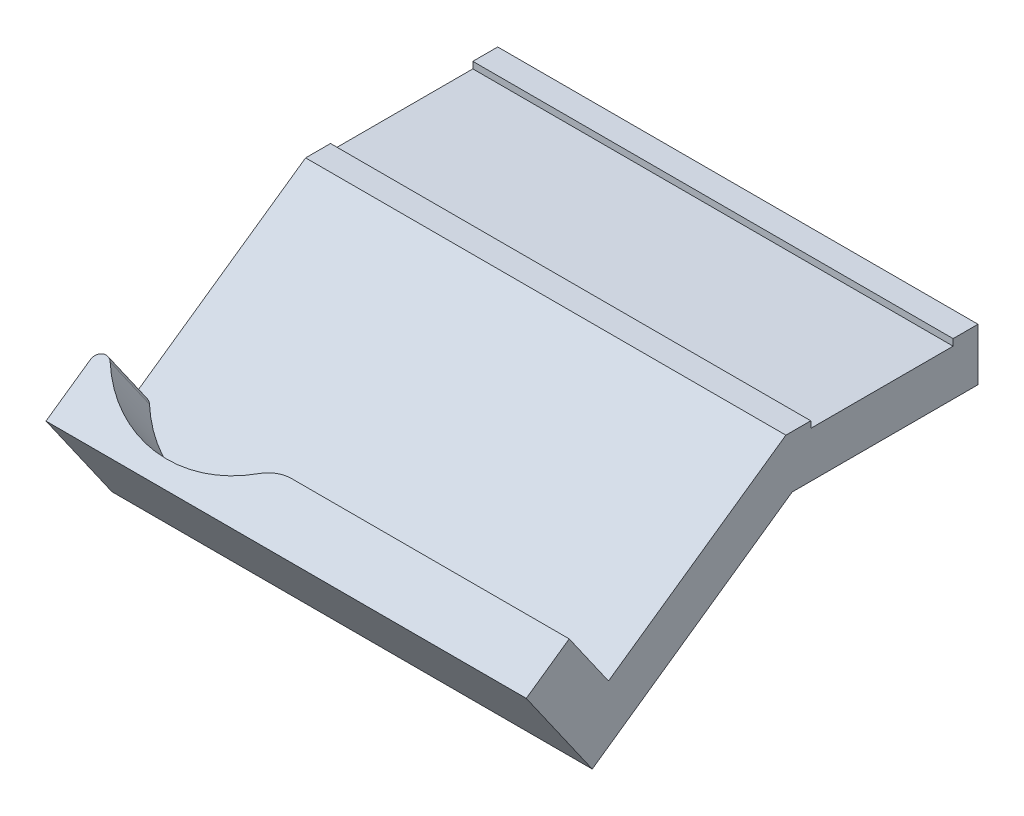
ISO-10303-21;
HEADER;
FILE_DESCRIPTION(('STEP AP214'),'2;1');
FILE_NAME('part.step','',(''),(''),'','','');
FILE_SCHEMA(('AUTOMOTIVE_DESIGN { 1 0 10303 214 1 1 1 1 }'));
ENDSEC;
DATA;
#1=APPLICATION_CONTEXT('core data for automotive mechanical design processes');
#2=APPLICATION_PROTOCOL_DEFINITION('international standard','automotive_design',2000,#1);
#3=PRODUCT_CONTEXT('',#1,'mechanical');
#4=PRODUCT('Part','Part','',(#3));
#5=PRODUCT_RELATED_PRODUCT_CATEGORY('part','',(#4));
#6=PRODUCT_DEFINITION_FORMATION('','',#4);
#7=PRODUCT_DEFINITION_CONTEXT('part definition',#1,'design');
#8=PRODUCT_DEFINITION('design','',#6,#7);
#9=PRODUCT_DEFINITION_SHAPE('','',#8);
#10=(LENGTH_UNIT() NAMED_UNIT(*) SI_UNIT(.MILLI.,.METRE.));
#11=(NAMED_UNIT(*) PLANE_ANGLE_UNIT() SI_UNIT($,.RADIAN.));
#12=(NAMED_UNIT(*) SI_UNIT($,.STERADIAN.) SOLID_ANGLE_UNIT());
#13=UNCERTAINTY_MEASURE_WITH_UNIT(LENGTH_MEASURE(1.E-05),#10,'distance_accuracy_value','');
#14=(GEOMETRIC_REPRESENTATION_CONTEXT(3) GLOBAL_UNCERTAINTY_ASSIGNED_CONTEXT((#13)) GLOBAL_UNIT_ASSIGNED_CONTEXT((#10,
#11,#12)) REPRESENTATION_CONTEXT('',''));
#15=CARTESIAN_POINT('',(0.,0.,0.));
#16=DIRECTION('',(0.,0.,1.));
#17=DIRECTION('',(1.,0.,0.));
#18=AXIS2_PLACEMENT_3D('',#15,#16,#17);
#19=CARTESIAN_POINT('',(55.,25.0544620715086,-50.5));
#20=DIRECTION('',(0.,-1.,0.));
#21=DIRECTION('',(0.,0.,-1.));
#22=AXIS2_PLACEMENT_3D('',#19,#20,#21);
#23=PLANE('',#22);
#24=DIRECTION('',(0.,0.,1.));
#25=VECTOR('',#24,1.);
#26=CARTESIAN_POINT('',(0.,25.0544620715086,-50.5));
#27=LINE('',#26,#25);
#28=CARTESIAN_POINT('',(0.,25.0544620715086,-50.5));
#29=VERTEX_POINT('',#28);
#30=CARTESIAN_POINT('',(0.,25.0544620715086,-47.65));
#31=VERTEX_POINT('',#30);
#32=EDGE_CURVE('E217',#29,#31,#27,.T.);
#33=ORIENTED_EDGE('',*,*,#32,.T.);
#34=DIRECTION('',(-1.,0.,0.));
#35=VECTOR('',#34,1.);
#36=CARTESIAN_POINT('',(0.,25.0544620715086,-47.65));
#37=LINE('',#36,#35);
#38=CARTESIAN_POINT('',(55.,25.0544620715086,-47.65));
#39=VERTEX_POINT('',#38);
#40=EDGE_CURVE('E181',#39,#31,#37,.T.);
#41=ORIENTED_EDGE('',*,*,#40,.F.);
#42=DIRECTION('',(0.,0.,1.));
#43=VECTOR('',#42,1.);
#44=CARTESIAN_POINT('',(55.,25.0544620715086,-50.5));
#45=LINE('',#44,#43);
#46=CARTESIAN_POINT('',(55.,25.0544620715086,-50.5));
#47=VERTEX_POINT('',#46);
#48=EDGE_CURVE('E213',#47,#39,#45,.T.);
#49=ORIENTED_EDGE('',*,*,#48,.F.);
#50=DIRECTION('',(1.,0.,0.));
#51=VECTOR('',#50,1.);
#52=CARTESIAN_POINT('',(55.,25.0544620715086,-50.5));
#53=LINE('',#52,#51);
#54=EDGE_CURVE('E210',#29,#47,#53,.T.);
#55=ORIENTED_EDGE('',*,*,#54,.F.);
#56=EDGE_LOOP('',(#33,#41,#49,#55));
#57=FACE_BOUND('',#56,.T.);
#58=ADVANCED_FACE('F35',(#57),#23,.F.);
#59=CARTESIAN_POINT('',(0.,50.,-33.));
#60=DIRECTION('',(1.,0.,0.));
#61=DIRECTION('',(0.,0.,-1.));
#62=AXIS2_PLACEMENT_3D('',#59,#60,#61);
#63=PLANE('',#62);
#64=DIRECTION('',(0.,0.,1.));
#65=VECTOR('',#64,1.);
#66=CARTESIAN_POINT('',(0.,24.3044620715086,-47.65));
#67=LINE('',#66,#65);
#68=CARTESIAN_POINT('',(0.,24.3044620715086,-47.65));
#69=VERTEX_POINT('',#68);
#70=CARTESIAN_POINT('',(0.,24.3044620715086,-31.35));
#71=VERTEX_POINT('',#70);
#72=EDGE_CURVE('E177',#69,#71,#67,.T.);
#73=ORIENTED_EDGE('',*,*,#72,.F.);
#74=DIRECTION('',(0.,1.,0.));
#75=VECTOR('',#74,1.);
#76=CARTESIAN_POINT('',(0.,24.3044620715086,-47.65));
#77=LINE('',#76,#75);
#78=EDGE_CURVE('E191',#69,#31,#77,.T.);
#79=ORIENTED_EDGE('',*,*,#78,.T.);
#80=ORIENTED_EDGE('',*,*,#32,.F.);
#81=DIRECTION('',(0.,1.,0.));
#82=VECTOR('',#81,1.);
#83=CARTESIAN_POINT('',(0.,25.0544620715086,-50.5));
#84=LINE('',#83,#82);
#85=CARTESIAN_POINT('',(0.,19.0544620715086,-50.5));
#86=VERTEX_POINT('',#85);
#87=EDGE_CURVE('E208',#86,#29,#84,.T.);
#88=ORIENTED_EDGE('',*,*,#87,.F.);
#89=DIRECTION('',(0.,0.,1.));
#90=VECTOR('',#89,1.);
#91=CARTESIAN_POINT('',(0.,19.0544620715086,-50.5));
#92=LINE('',#91,#90);
#93=CARTESIAN_POINT('',(0.,19.0544620715086,-29.214074003371));
#94=VERTEX_POINT('',#93);
#95=EDGE_CURVE('E220',#86,#94,#92,.T.);
#96=ORIENTED_EDGE('',*,*,#95,.T.);
#97=DIRECTION('',(0.,-0.573576436351041,0.819152044288995));
#98=VECTOR('',#97,1.);
#99=CARTESIAN_POINT('',(0.,18.5544620715086,-28.5));
#100=LINE('',#99,#98);
#101=CARTESIAN_POINT('',(0.,3.02755103414072,-6.32527295112067));
#102=VERTEX_POINT('',#101);
#103=EDGE_CURVE('E221',#94,#102,#100,.T.);
#104=ORIENTED_EDGE('',*,*,#103,.T.);
#105=DIRECTION('',(0.,0.819152044288995,0.573576436351042));
#106=VECTOR('',#105,1.);
#107=CARTESIAN_POINT('',(0.,13.8157825302888,1.22872806643351));
#108=LINE('',#107,#106);
#109=CARTESIAN_POINT('',(0.,13.8157825302888,1.22872806643351));
#110=VERTEX_POINT('',#109);
#111=EDGE_CURVE('E173',#102,#110,#108,.T.);
#112=ORIENTED_EDGE('',*,*,#111,.T.);
#113=DIRECTION('',(0.,0.573576436351042,-0.819152044288995));
#114=VECTOR('',#113,1.);
#115=CARTESIAN_POINT('',(0.,10.6909016668292,5.69152044288994));
#116=LINE('',#115,#114);
#117=CARTESIAN_POINT('',(0.,17.3566866817595,-3.82820713955444));
#118=VERTEX_POINT('',#117);
#119=EDGE_CURVE('E156',#110,#118,#116,.T.);
#120=ORIENTED_EDGE('',*,*,#119,.T.);
#121=DIRECTION('',(0.,0.819152044288995,0.573576436351042));
#122=VECTOR('',#121,1.);
#123=CARTESIAN_POINT('',(0.,10.93002065142,-8.32820713955443));
#124=LINE('',#123,#122);
#125=CARTESIAN_POINT('',(0.,10.93002065142,-8.32820713955442));
#126=VERTEX_POINT('',#125);
#127=EDGE_CURVE('E248',#118,#126,#124,.F.);
#128=ORIENTED_EDGE('',*,*,#127,.T.);
#129=DIRECTION('',(0.,-0.573576436351042,0.819152044288995));
#130=VECTOR('',#129,1.);
#131=CARTESIAN_POINT('',(0.,35.3756012037032,-43.2401142789519));
#132=LINE('',#131,#130);
#133=CARTESIAN_POINT('',(0.,25.0544620715086,-28.5));
#134=VERTEX_POINT('',#133);
#135=EDGE_CURVE('E231',#134,#126,#132,.T.);
#136=ORIENTED_EDGE('',*,*,#135,.F.);
#137=CARTESIAN_POINT('',(0.,25.0544620715086,-31.35));
#138=VERTEX_POINT('',#137);
#139=EDGE_CURVE('E216',#138,#134,#27,.T.);
#140=ORIENTED_EDGE('',*,*,#139,.F.);
#141=DIRECTION('',(0.,1.,0.));
#142=VECTOR('',#141,1.);
#143=CARTESIAN_POINT('',(0.,24.3044620715086,-31.35));
#144=LINE('',#143,#142);
#145=EDGE_CURVE('E52',#71,#138,#144,.T.);
#146=ORIENTED_EDGE('',*,*,#145,.F.);
#147=EDGE_LOOP('',(#73,#79,#80,#88,#96,#104,#112,#120,#128,#136,#140,#146));
#148=FACE_BOUND('',#147,.T.);
#149=ADVANCED_FACE('F273',(#148),#63,.F.);
#150=CARTESIAN_POINT('',(55.,50.,-33.));
#151=DIRECTION('',(1.,0.,0.));
#152=DIRECTION('',(0.,0.,-1.));
#153=AXIS2_PLACEMENT_3D('',#150,#151,#152);
#154=PLANE('',#153);
#155=DIRECTION('',(0.,1.,0.));
#156=VECTOR('',#155,1.);
#157=CARTESIAN_POINT('',(55.,24.3044620715086,-47.65));
#158=LINE('',#157,#156);
#159=CARTESIAN_POINT('',(55.,24.3044620715086,-47.65));
#160=VERTEX_POINT('',#159);
#161=EDGE_CURVE('E195',#160,#39,#158,.T.);
#162=ORIENTED_EDGE('',*,*,#161,.F.);
#163=DIRECTION('',(0.,0.,-1.));
#164=VECTOR('',#163,1.);
#165=CARTESIAN_POINT('',(55.,24.3044620715086,-47.65));
#166=LINE('',#165,#164);
#167=CARTESIAN_POINT('',(55.,24.3044620715086,-31.35));
#168=VERTEX_POINT('',#167);
#169=EDGE_CURVE('E184',#168,#160,#166,.T.);
#170=ORIENTED_EDGE('',*,*,#169,.F.);
#171=DIRECTION('',(0.,1.,0.));
#172=VECTOR('',#171,1.);
#173=CARTESIAN_POINT('',(55.,24.3044620715086,-31.35));
#174=LINE('',#173,#172);
#175=CARTESIAN_POINT('',(55.,25.0544620715086,-31.35));
#176=VERTEX_POINT('',#175);
#177=EDGE_CURVE('E197',#168,#176,#174,.T.);
#178=ORIENTED_EDGE('',*,*,#177,.T.);
#179=CARTESIAN_POINT('',(55.,25.0544620715086,-28.5));
#180=VERTEX_POINT('',#179);
#181=EDGE_CURVE('E212',#176,#180,#45,.T.);
#182=ORIENTED_EDGE('',*,*,#181,.T.);
#183=DIRECTION('',(0.,0.573576436351041,-0.819152044288995));
#184=VECTOR('',#183,1.);
#185=CARTESIAN_POINT('',(55.,10.,-7.));
#186=LINE('',#185,#184);
#187=CARTESIAN_POINT('',(55.,10.831685832709,-8.18777046421904));
#188=VERTEX_POINT('',#187);
#189=EDGE_CURVE('E239',#188,#180,#186,.T.);
#190=ORIENTED_EDGE('',*,*,#189,.F.);
#191=DIRECTION('',(0.,0.819152044288995,0.573576436351042));
#192=VECTOR('',#191,1.);
#193=CARTESIAN_POINT('',(55.,10.831685832709,-8.18777046421904));
#194=LINE('',#193,#192);
#195=CARTESIAN_POINT('',(55.,17.2583518630486,-3.68777046421905));
#196=VERTEX_POINT('',#195);
#197=EDGE_CURVE('E153',#188,#196,#194,.T.);
#198=ORIENTED_EDGE('',*,*,#197,.T.);
#199=DIRECTION('',(0.,0.573576436351042,-0.819152044288995));
#200=VECTOR('',#199,1.);
#201=CARTESIAN_POINT('',(55.,10.6909016668292,5.69152044288994));
#202=LINE('',#201,#200);
#203=CARTESIAN_POINT('',(55.,13.8157825302888,1.2287280664335));
#204=VERTEX_POINT('',#203);
#205=EDGE_CURVE('E145',#204,#196,#202,.T.);
#206=ORIENTED_EDGE('',*,*,#205,.F.);
#207=DIRECTION('',(0.,-0.819152044288995,-0.573576436351042));
#208=VECTOR('',#207,1.);
#209=CARTESIAN_POINT('',(55.,13.8157825302888,1.2287280664335));
#210=LINE('',#209,#208);
#211=CARTESIAN_POINT('',(55.,3.02755103414072,-6.32527295112069));
#212=VERTEX_POINT('',#211);
#213=EDGE_CURVE('E150',#204,#212,#210,.T.);
#214=ORIENTED_EDGE('',*,*,#213,.T.);
#215=DIRECTION('',(0.,-0.573576436351041,0.819152044288995));
#216=VECTOR('',#215,1.);
#217=CARTESIAN_POINT('',(55.,18.5544620715086,-28.5));
#218=LINE('',#217,#216);
#219=CARTESIAN_POINT('',(55.,19.0544620715086,-29.214074003371));
#220=VERTEX_POINT('',#219);
#221=EDGE_CURVE('E224',#220,#212,#218,.T.);
#222=ORIENTED_EDGE('',*,*,#221,.F.);
#223=DIRECTION('',(0.,0.,1.));
#224=VECTOR('',#223,1.);
#225=CARTESIAN_POINT('',(55.,19.0544620715086,-50.5));
#226=LINE('',#225,#224);
#227=CARTESIAN_POINT('',(55.,19.0544620715086,-50.5));
#228=VERTEX_POINT('',#227);
#229=EDGE_CURVE('E226',#228,#220,#226,.T.);
#230=ORIENTED_EDGE('',*,*,#229,.F.);
#231=DIRECTION('',(0.,-1.,0.));
#232=VECTOR('',#231,1.);
#233=CARTESIAN_POINT('',(55.,25.0544620715086,-50.5));
#234=LINE('',#233,#232);
#235=EDGE_CURVE('E203',#47,#228,#234,.T.);
#236=ORIENTED_EDGE('',*,*,#235,.F.);
#237=ORIENTED_EDGE('',*,*,#48,.T.);
#238=EDGE_LOOP('',(#162,#170,#178,#182,#190,#198,#206,#214,#222,#230,#236,#237));
#239=FACE_BOUND('',#238,.T.);
#240=ADVANCED_FACE('F148',(#239),#154,.T.);
#241=CARTESIAN_POINT('',(5.,10.,-7.));
#242=DIRECTION('',(0.,-0.819152044288995,-0.573576436351041));
#243=DIRECTION('',(0.,0.573576436351042,-0.819152044288995));
#244=AXIS2_PLACEMENT_3D('',#241,#242,#243);
#245=PLANE('',#244);
#246=ORIENTED_EDGE('',*,*,#189,.T.);
#247=DIRECTION('',(1.,0.,0.));
#248=VECTOR('',#247,1.);
#249=CARTESIAN_POINT('',(0.,25.0544620715086,-28.5));
#250=LINE('',#249,#248);
#251=EDGE_CURVE('E223',#134,#180,#250,.T.);
#252=ORIENTED_EDGE('',*,*,#251,.F.);
#253=ORIENTED_EDGE('',*,*,#135,.T.);
#254=CARTESIAN_POINT('',(0.999999999999999,10.93002065142,-8.32820713955443));
#255=DIRECTION('',(0.,-0.819152044288995,-0.573576436351041));
#256=DIRECTION('',(0.,0.573576436351042,-0.819152044288995));
#257=AXIS2_PLACEMENT_3D('',#254,#255,#256);
#258=CIRCLE('',#257,1.);
#259=CARTESIAN_POINT('',(1.7457627118644,11.3121439619383,-8.87393578380093));
#260=VERTEX_POINT('',#259);
#261=EDGE_CURVE('E251',#126,#260,#258,.T.);
#262=ORIENTED_EDGE('',*,*,#261,.T.);
#263=CARTESIAN_POINT('',(12.,16.5663394815659,-16.3777046421904));
#264=DIRECTION('',(0.,0.819152044288995,0.573576436351042));
#265=DIRECTION('',(0.,-0.573576436351042,0.819152044288995));
#266=AXIS2_PLACEMENT_3D('',#263,#264,#265);
#267=CIRCLE('',#266,13.75);
#268=CARTESIAN_POINT('',(20.2518930997733,10.2578132057837,-7.36819541595175));
#269=VERTEX_POINT('',#268);
#270=EDGE_CURVE('E229',#260,#269,#267,.T.);
#271=ORIENTED_EDGE('',*,*,#270,.T.);
#272=CARTESIAN_POINT('',(23.2525814996909,7.9638036509538,-4.09201024277405));
#273=DIRECTION('',(0.,-0.819152044288995,-0.573576436351041));
#274=DIRECTION('',(0.,0.573576436351042,-0.819152044288995));
#275=AXIS2_PLACEMENT_3D('',#272,#273,#274);
#276=CIRCLE('',#275,5.);
#277=CARTESIAN_POINT('',(23.2525814996909,10.831685832709,-8.18777046421904));
#278=VERTEX_POINT('',#277);
#279=EDGE_CURVE('E11',#269,#278,#276,.T.);
#280=ORIENTED_EDGE('',*,*,#279,.T.);
#281=DIRECTION('',(1.,0.,0.));
#282=VECTOR('',#281,1.);
#283=CARTESIAN_POINT('',(0.,10.831685832709,-8.18777046421904));
#284=LINE('',#283,#282);
#285=EDGE_CURVE('E236',#278,#188,#284,.T.);
#286=ORIENTED_EDGE('',*,*,#285,.T.);
#287=EDGE_LOOP('',(#246,#252,#253,#262,#271,#280,#286));
#288=FACE_BOUND('',#287,.T.);
#289=ADVANCED_FACE('F295',(#288),#245,.F.);
#290=CARTESIAN_POINT('',(0.,10.831685832709,-8.18777046421904));
#291=DIRECTION('',(0.,0.573576436351042,-0.819152044288995));
#292=DIRECTION('',(0.,0.819152044288995,0.573576436351042));
#293=AXIS2_PLACEMENT_3D('',#290,#291,#292);
#294=PLANE('',#293);
#295=ORIENTED_EDGE('',*,*,#285,.F.);
#296=DIRECTION('',(0.,-0.819152044288995,-0.573576436351042));
#297=VECTOR('',#296,1.);
#298=CARTESIAN_POINT('',(23.2525814996909,10.831685832709,-8.18777046421904));
#299=LINE('',#298,#297);
#300=CARTESIAN_POINT('',(23.2525814996909,17.2583518630486,-3.68777046421905));
#301=VERTEX_POINT('',#300);
#302=EDGE_CURVE('E253',#278,#301,#299,.F.);
#303=ORIENTED_EDGE('',*,*,#302,.T.);
#304=DIRECTION('',(1.,0.,0.));
#305=VECTOR('',#304,1.);
#306=CARTESIAN_POINT('',(0.,17.2583518630486,-3.68777046421905));
#307=LINE('',#306,#305);
#308=EDGE_CURVE('E157',#301,#196,#307,.T.);
#309=ORIENTED_EDGE('',*,*,#308,.T.);
#310=ORIENTED_EDGE('',*,*,#197,.F.);
#311=EDGE_LOOP('',(#295,#303,#309,#310));
#312=FACE_BOUND('',#311,.T.);
#313=ADVANCED_FACE('F298',(#312),#294,.T.);
#314=CARTESIAN_POINT('',(0.,10.6909016668292,5.69152044288994));
#315=DIRECTION('',(0.,-0.819152044288995,-0.573576436351042));
#316=DIRECTION('',(0.,0.573576436351042,-0.819152044288995));
#317=AXIS2_PLACEMENT_3D('',#314,#315,#316);
#318=PLANE('',#317);
#319=ORIENTED_EDGE('',*,*,#308,.F.);
#320=CARTESIAN_POINT('',(23.2525814996909,14.3904696812934,0.407989757225932));
#321=DIRECTION('',(0.,-0.819152044288995,-0.573576436351042));
#322=DIRECTION('',(0.,0.573576436351042,-0.819152044288995));
#323=AXIS2_PLACEMENT_3D('',#320,#321,#322);
#324=CIRCLE('',#323,5.);
#325=CARTESIAN_POINT('',(20.2518930997733,16.6844792361233,-2.86819541595176));
#326=VERTEX_POINT('',#325);
#327=EDGE_CURVE('E256',#301,#326,#324,.F.);
#328=ORIENTED_EDGE('',*,*,#327,.T.);
#329=CARTESIAN_POINT('',(12.,22.9930055119054,-11.8777046421904));
#330=DIRECTION('',(0.,-0.819152044288995,-0.573576436351042));
#331=DIRECTION('',(0.,0.573576436351042,-0.819152044288995));
#332=AXIS2_PLACEMENT_3D('',#329,#330,#331);
#333=CIRCLE('',#332,13.75);
#334=CARTESIAN_POINT('',(1.74576271186441,17.7388099922779,-4.37393578380095));
#335=VERTEX_POINT('',#334);
#336=EDGE_CURVE('E233',#335,#326,#333,.F.);
#337=ORIENTED_EDGE('',*,*,#336,.F.);
#338=CARTESIAN_POINT('',(0.999999999999999,17.3566866817595,-3.82820713955444));
#339=DIRECTION('',(0.,-0.819152044288995,-0.573576436351042));
#340=DIRECTION('',(0.,0.573576436351042,-0.819152044288995));
#341=AXIS2_PLACEMENT_3D('',#338,#339,#340);
#342=CIRCLE('',#341,1.);
#343=EDGE_CURVE('E246',#335,#118,#342,.F.);
#344=ORIENTED_EDGE('',*,*,#343,.T.);
#345=ORIENTED_EDGE('',*,*,#119,.F.);
#346=DIRECTION('',(1.,0.,0.));
#347=VECTOR('',#346,1.);
#348=CARTESIAN_POINT('',(-14.5885613562213,13.8157825302888,1.22872806643351));
#349=LINE('',#348,#347);
#350=EDGE_CURVE('E160',#110,#204,#349,.T.);
#351=ORIENTED_EDGE('',*,*,#350,.T.);
#352=ORIENTED_EDGE('',*,*,#205,.T.);
#353=EDGE_LOOP('',(#319,#328,#337,#344,#345,#351,#352));
#354=FACE_BOUND('',#353,.T.);
#355=ADVANCED_FACE('F161',(#354),#318,.F.);
#356=CARTESIAN_POINT('',(12.,46.6956665208301,4.71907727188781));
#357=DIRECTION('',(0.,-0.819152044288995,-0.573576436351042));
#358=DIRECTION('',(0.,0.573576436351042,-0.819152044288995));
#359=AXIS2_PLACEMENT_3D('',#356,#357,#358);
#360=CYLINDRICAL_SURFACE('',#359,13.75);
#361=ORIENTED_EDGE('',*,*,#336,.T.);
#362=DIRECTION('',(0.,-0.819152044288995,-0.573576436351042));
#363=VECTOR('',#362,1.);
#364=CARTESIAN_POINT('',(20.2518930997733,40.3871402450479,13.7285864981265));
#365=LINE('',#364,#363);
#366=EDGE_CURVE('E44',#326,#269,#365,.T.);
#367=ORIENTED_EDGE('',*,*,#366,.T.);
#368=ORIENTED_EDGE('',*,*,#270,.F.);
#369=DIRECTION('',(0.,-0.819152044288995,-0.573576436351042));
#370=VECTOR('',#369,1.);
#371=CARTESIAN_POINT('',(1.74576271186441,41.4414710012026,12.2228461302773));
#372=LINE('',#371,#370);
#373=EDGE_CURVE('E243',#260,#335,#372,.F.);
#374=ORIENTED_EDGE('',*,*,#373,.T.);
#375=EDGE_LOOP('',(#361,#367,#368,#374));
#376=FACE_BOUND('',#375,.T.);
#377=ADVANCED_FACE('F302',(#376),#360,.F.);
#378=CARTESIAN_POINT('',(0.999999999999999,41.0593476906842,12.7685747745238));
#379=DIRECTION('',(0.,-0.819152044288995,-0.573576436351042));
#380=DIRECTION('',(0.,0.573576436351042,-0.819152044288995));
#381=AXIS2_PLACEMENT_3D('',#378,#379,#380);
#382=CYLINDRICAL_SURFACE('',#381,1.);
#383=ORIENTED_EDGE('',*,*,#261,.F.);
#384=ORIENTED_EDGE('',*,*,#127,.F.);
#385=ORIENTED_EDGE('',*,*,#343,.F.);
#386=ORIENTED_EDGE('',*,*,#373,.F.);
#387=EDGE_LOOP('',(#383,#384,#385,#386));
#388=FACE_BOUND('',#387,.T.);
#389=ADVANCED_FACE('F307',(#388),#382,.T.);
#390=CARTESIAN_POINT('',(23.2525814996909,38.093130690218,17.0047716713042));
#391=DIRECTION('',(0.,-0.819152044288995,-0.573576436351042));
#392=DIRECTION('',(0.,0.573576436351042,-0.819152044288995));
#393=AXIS2_PLACEMENT_3D('',#390,#391,#392);
#394=CYLINDRICAL_SURFACE('',#393,5.);
#395=ORIENTED_EDGE('',*,*,#279,.F.);
#396=ORIENTED_EDGE('',*,*,#366,.F.);
#397=ORIENTED_EDGE('',*,*,#327,.F.);
#398=ORIENTED_EDGE('',*,*,#302,.F.);
#399=EDGE_LOOP('',(#395,#396,#397,#398));
#400=FACE_BOUND('',#399,.T.);
#401=ADVANCED_FACE('F37',(#400),#394,.T.);
#402=CARTESIAN_POINT('',(0.,18.5544620715086,-28.5));
#403=DIRECTION('',(0.,0.819152044288995,0.573576436351041));
#404=DIRECTION('',(0.,-0.573576436351041,0.819152044288995));
#405=AXIS2_PLACEMENT_3D('',#402,#403,#404);
#406=PLANE('',#405);
#407=ORIENTED_EDGE('',*,*,#221,.T.);
#408=DIRECTION('',(1.,0.,0.));
#409=VECTOR('',#408,1.);
#410=CARTESIAN_POINT('',(-14.5885613562213,3.02755103414072,-6.32527295112067));
#411=LINE('',#410,#409);
#412=EDGE_CURVE('E166',#102,#212,#411,.T.);
#413=ORIENTED_EDGE('',*,*,#412,.F.);
#414=ORIENTED_EDGE('',*,*,#103,.F.);
#415=DIRECTION('',(-1.,0.,0.));
#416=VECTOR('',#415,1.);
#417=CARTESIAN_POINT('',(55.,19.0544620715086,-29.214074003371));
#418=LINE('',#417,#416);
#419=EDGE_CURVE('E194',#220,#94,#418,.T.);
#420=ORIENTED_EDGE('',*,*,#419,.F.);
#421=EDGE_LOOP('',(#407,#413,#414,#420));
#422=FACE_BOUND('',#421,.T.);
#423=ADVANCED_FACE('F270',(#422),#406,.F.);
#424=CARTESIAN_POINT('',(55.,19.0544620715086,-50.5));
#425=DIRECTION('',(0.,1.,0.));
#426=DIRECTION('',(0.,0.,1.));
#427=AXIS2_PLACEMENT_3D('',#424,#425,#426);
#428=PLANE('',#427);
#429=ORIENTED_EDGE('',*,*,#229,.T.);
#430=ORIENTED_EDGE('',*,*,#419,.T.);
#431=ORIENTED_EDGE('',*,*,#95,.F.);
#432=DIRECTION('',(-1.,0.,0.));
#433=VECTOR('',#432,1.);
#434=CARTESIAN_POINT('',(55.,19.0544620715086,-50.5));
#435=LINE('',#434,#433);
#436=EDGE_CURVE('E206',#228,#86,#435,.T.);
#437=ORIENTED_EDGE('',*,*,#436,.F.);
#438=EDGE_LOOP('',(#429,#430,#431,#437));
#439=FACE_BOUND('',#438,.T.);
#440=ADVANCED_FACE('F265',(#439),#428,.F.);
#441=ORIENTED_EDGE('',*,*,#181,.F.);
#442=DIRECTION('',(1.,0.,0.));
#443=VECTOR('',#442,1.);
#444=CARTESIAN_POINT('',(0.,25.0544620715086,-31.35));
#445=LINE('',#444,#443);
#446=EDGE_CURVE('E176',#138,#176,#445,.T.);
#447=ORIENTED_EDGE('',*,*,#446,.F.);
#448=ORIENTED_EDGE('',*,*,#139,.T.);
#449=ORIENTED_EDGE('',*,*,#251,.T.);
#450=EDGE_LOOP('',(#441,#447,#448,#449));
#451=FACE_BOUND('',#450,.T.);
#452=ADVANCED_FACE('F293',(#451),#23,.F.);
#453=CARTESIAN_POINT('',(0.,0.,-50.5));
#454=DIRECTION('',(0.,0.,-1.));
#455=DIRECTION('',(-1.,0.,0.));
#456=AXIS2_PLACEMENT_3D('',#453,#454,#455);
#457=PLANE('',#456);
#458=ORIENTED_EDGE('',*,*,#235,.T.);
#459=ORIENTED_EDGE('',*,*,#436,.T.);
#460=ORIENTED_EDGE('',*,*,#87,.T.);
#461=ORIENTED_EDGE('',*,*,#54,.T.);
#462=EDGE_LOOP('',(#458,#459,#460,#461));
#463=FACE_BOUND('',#462,.T.);
#464=ADVANCED_FACE('F278',(#463),#457,.T.);
#465=CARTESIAN_POINT('',(0.,24.3044620715086,-47.65));
#466=DIRECTION('',(0.,0.,-1.));
#467=DIRECTION('',(-1.,0.,0.));
#468=AXIS2_PLACEMENT_3D('',#465,#466,#467);
#469=PLANE('',#468);
#470=ORIENTED_EDGE('',*,*,#40,.T.);
#471=ORIENTED_EDGE('',*,*,#78,.F.);
#472=DIRECTION('',(-1.,0.,0.));
#473=VECTOR('',#472,1.);
#474=CARTESIAN_POINT('',(0.,24.3044620715086,-47.65));
#475=LINE('',#474,#473);
#476=EDGE_CURVE('E186',#160,#69,#475,.T.);
#477=ORIENTED_EDGE('',*,*,#476,.F.);
#478=ORIENTED_EDGE('',*,*,#161,.T.);
#479=EDGE_LOOP('',(#470,#471,#477,#478));
#480=FACE_BOUND('',#479,.T.);
#481=ADVANCED_FACE('F285',(#480),#469,.F.);
#482=CARTESIAN_POINT('',(0.,24.3044620715086,-31.35));
#483=DIRECTION('',(0.,0.,1.));
#484=DIRECTION('',(1.,0.,0.));
#485=AXIS2_PLACEMENT_3D('',#482,#483,#484);
#486=PLANE('',#485);
#487=ORIENTED_EDGE('',*,*,#446,.T.);
#488=ORIENTED_EDGE('',*,*,#177,.F.);
#489=DIRECTION('',(1.,0.,0.));
#490=VECTOR('',#489,1.);
#491=CARTESIAN_POINT('',(0.,24.3044620715086,-31.35));
#492=LINE('',#491,#490);
#493=EDGE_CURVE('E180',#71,#168,#492,.T.);
#494=ORIENTED_EDGE('',*,*,#493,.F.);
#495=ORIENTED_EDGE('',*,*,#145,.T.);
#496=EDGE_LOOP('',(#487,#488,#494,#495));
#497=FACE_BOUND('',#496,.T.);
#498=ADVANCED_FACE('F386',(#497),#486,.F.);
#499=CARTESIAN_POINT('',(0.,24.3044620715086,0.));
#500=DIRECTION('',(0.,1.,0.));
#501=DIRECTION('',(0.,0.,1.));
#502=AXIS2_PLACEMENT_3D('',#499,#500,#501);
#503=PLANE('',#502);
#504=ORIENTED_EDGE('',*,*,#72,.T.);
#505=ORIENTED_EDGE('',*,*,#493,.T.);
#506=ORIENTED_EDGE('',*,*,#169,.T.);
#507=ORIENTED_EDGE('',*,*,#476,.T.);
#508=EDGE_LOOP('',(#504,#505,#506,#507));
#509=FACE_BOUND('',#508,.T.);
#510=ADVANCED_FACE('F287',(#509),#503,.T.);
#511=CARTESIAN_POINT('',(-14.5885613562213,13.8157825302888,1.22872806643351));
#512=DIRECTION('',(0.,-0.573576436351042,0.819152044288995));
#513=DIRECTION('',(0.,-0.819152044288995,-0.573576436351042));
#514=AXIS2_PLACEMENT_3D('',#511,#512,#513);
#515=PLANE('',#514);
#516=ORIENTED_EDGE('',*,*,#111,.F.);
#517=ORIENTED_EDGE('',*,*,#412,.T.);
#518=ORIENTED_EDGE('',*,*,#213,.F.);
#519=ORIENTED_EDGE('',*,*,#350,.F.);
#520=EDGE_LOOP('',(#516,#517,#518,#519));
#521=FACE_BOUND('',#520,.T.);
#522=ADVANCED_FACE('F169',(#521),#515,.T.);
#523=CLOSED_SHELL('',(#58,#149,#240,#289,#313,#355,#377,#389,#401,#423,#440,#452,#464,#481,#498,
#510,#522));
#524=MANIFOLD_SOLID_BREP('B2',#523);
#525=ADVANCED_BREP_SHAPE_REPRESENTATION('',(#18,#524),#14);
#526=SHAPE_DEFINITION_REPRESENTATION(#9,#525);
ENDSEC;
END-ISO-10303-21;
